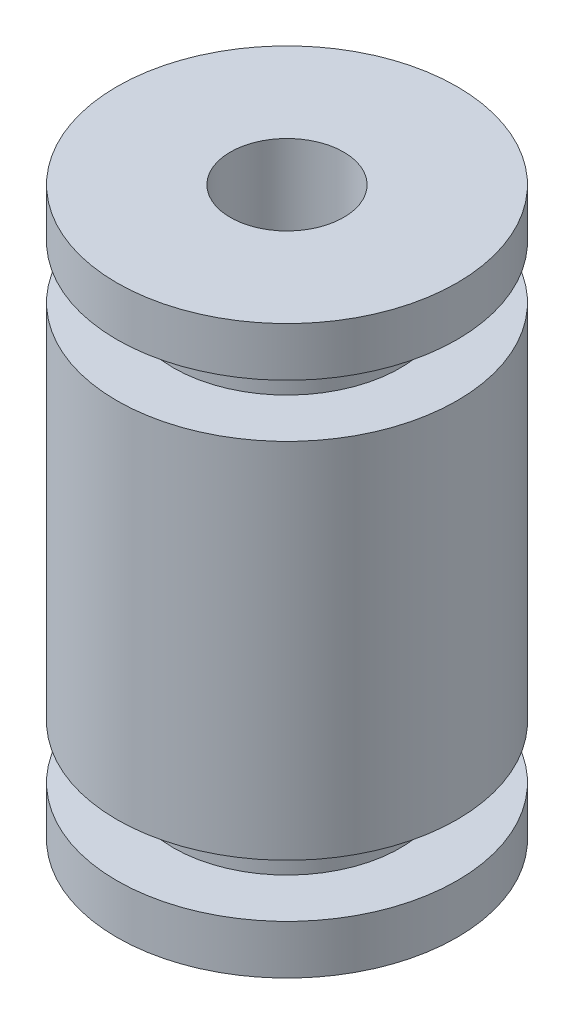
ISO-10303-21;
HEADER;
FILE_DESCRIPTION(('STEP AP214'),'2;1');
FILE_NAME('part.step','',(''),(''),'','','');
FILE_SCHEMA(('AUTOMOTIVE_DESIGN { 1 0 10303 214 1 1 1 1 }'));
ENDSEC;
DATA;
#1=APPLICATION_CONTEXT('core data for automotive mechanical design processes');
#2=APPLICATION_PROTOCOL_DEFINITION('international standard','automotive_design',2000,#1);
#3=PRODUCT_CONTEXT('',#1,'mechanical');
#4=PRODUCT('Part','Part','',(#3));
#5=PRODUCT_RELATED_PRODUCT_CATEGORY('part','',(#4));
#6=PRODUCT_DEFINITION_FORMATION('','',#4);
#7=PRODUCT_DEFINITION_CONTEXT('part definition',#1,'design');
#8=PRODUCT_DEFINITION('design','',#6,#7);
#9=PRODUCT_DEFINITION_SHAPE('','',#8);
#10=(LENGTH_UNIT() NAMED_UNIT(*) SI_UNIT(.MILLI.,.METRE.));
#11=(NAMED_UNIT(*) PLANE_ANGLE_UNIT() SI_UNIT($,.RADIAN.));
#12=(NAMED_UNIT(*) SI_UNIT($,.STERADIAN.) SOLID_ANGLE_UNIT());
#13=UNCERTAINTY_MEASURE_WITH_UNIT(LENGTH_MEASURE(1.E-05),#10,'distance_accuracy_value','');
#14=(GEOMETRIC_REPRESENTATION_CONTEXT(3) GLOBAL_UNCERTAINTY_ASSIGNED_CONTEXT((#13)) GLOBAL_UNIT_ASSIGNED_CONTEXT((#10,
#11,#12)) REPRESENTATION_CONTEXT('',''));
#15=CARTESIAN_POINT('',(0.,0.,0.));
#16=DIRECTION('',(0.,0.,1.));
#17=DIRECTION('',(1.,0.,0.));
#18=AXIS2_PLACEMENT_3D('',#15,#16,#17);
#19=CARTESIAN_POINT('',(-1.5,7.5,0.));
#20=DIRECTION('',(0.,-1.,0.));
#21=DIRECTION('',(0.,0.,-1.));
#22=AXIS2_PLACEMENT_3D('',#19,#20,#21);
#23=PLANE('',#22);
#24=CARTESIAN_POINT('',(0.,7.5,0.));
#25=DIRECTION('',(0.,-1.,0.));
#26=DIRECTION('',(0.,0.,-1.));
#27=AXIS2_PLACEMENT_3D('',#24,#25,#26);
#28=CIRCLE('',#27,4.5);
#29=CARTESIAN_POINT('',(0.,7.5,-4.5));
#30=VERTEX_POINT('',#29);
#31=EDGE_CURVE('E10',#30,#30,#28,.T.);
#32=ORIENTED_EDGE('',*,*,#31,.F.);
#33=EDGE_LOOP('',(#32));
#34=FACE_BOUND('',#33,.T.);
#35=CARTESIAN_POINT('',(0.,7.5,0.));
#36=DIRECTION('',(0.,-1.,0.));
#37=DIRECTION('',(0.,0.,-1.));
#38=AXIS2_PLACEMENT_3D('',#35,#36,#37);
#39=CIRCLE('',#38,1.5);
#40=CARTESIAN_POINT('',(0.,7.5,-1.5));
#41=VERTEX_POINT('',#40);
#42=EDGE_CURVE('E71',#41,#41,#39,.T.);
#43=ORIENTED_EDGE('',*,*,#42,.T.);
#44=EDGE_LOOP('',(#43));
#45=FACE_BOUND('',#44,.T.);
#46=ADVANCED_FACE('F31',(#34,#45),#23,.F.);
#47=CARTESIAN_POINT('',(0.,0.,0.));
#48=DIRECTION('',(0.,-1.,0.));
#49=DIRECTION('',(0.,0.,-1.));
#50=AXIS2_PLACEMENT_3D('',#47,#48,#49);
#51=CYLINDRICAL_SURFACE('',#50,4.5);
#52=CARTESIAN_POINT('',(0.,6.2,0.));
#53=DIRECTION('',(0.,-1.,0.));
#54=DIRECTION('',(0.,0.,-1.));
#55=AXIS2_PLACEMENT_3D('',#52,#53,#54);
#56=CIRCLE('',#55,4.5);
#57=CARTESIAN_POINT('',(0.,6.2,-4.5));
#58=VERTEX_POINT('',#57);
#59=EDGE_CURVE('E37',#58,#58,#56,.T.);
#60=ORIENTED_EDGE('',*,*,#59,.F.);
#61=EDGE_LOOP('',(#60));
#62=FACE_BOUND('',#61,.T.);
#63=ORIENTED_EDGE('',*,*,#31,.T.);
#64=EDGE_LOOP('',(#63));
#65=FACE_BOUND('',#64,.T.);
#66=ADVANCED_FACE('F132',(#62,#65),#51,.T.);
#67=CARTESIAN_POINT('',(-4.5,6.2,0.));
#68=DIRECTION('',(0.,1.,0.));
#69=DIRECTION('',(0.,0.,1.));
#70=AXIS2_PLACEMENT_3D('',#67,#68,#69);
#71=PLANE('',#70);
#72=CARTESIAN_POINT('',(0.,6.2,0.));
#73=DIRECTION('',(0.,-1.,0.));
#74=DIRECTION('',(0.,0.,-1.));
#75=AXIS2_PLACEMENT_3D('',#72,#73,#74);
#76=CIRCLE('',#75,3.);
#77=CARTESIAN_POINT('',(0.,6.2,-3.));
#78=VERTEX_POINT('',#77);
#79=EDGE_CURVE('E41',#78,#78,#76,.T.);
#80=ORIENTED_EDGE('',*,*,#79,.F.);
#81=EDGE_LOOP('',(#80));
#82=FACE_BOUND('',#81,.T.);
#83=ORIENTED_EDGE('',*,*,#59,.T.);
#84=EDGE_LOOP('',(#83));
#85=FACE_BOUND('',#84,.T.);
#86=ADVANCED_FACE('F127',(#82,#85),#71,.F.);
#87=CARTESIAN_POINT('',(0.,0.,0.));
#88=DIRECTION('',(0.,-1.,0.));
#89=DIRECTION('',(0.,0.,-1.));
#90=AXIS2_PLACEMENT_3D('',#87,#88,#89);
#91=CYLINDRICAL_SURFACE('',#90,3.);
#92=CARTESIAN_POINT('',(0.,4.8,0.));
#93=DIRECTION('',(0.,-1.,0.));
#94=DIRECTION('',(0.,0.,-1.));
#95=AXIS2_PLACEMENT_3D('',#92,#93,#94);
#96=CIRCLE('',#95,3.);
#97=CARTESIAN_POINT('',(0.,4.8,-3.));
#98=VERTEX_POINT('',#97);
#99=EDGE_CURVE('E45',#98,#98,#96,.T.);
#100=ORIENTED_EDGE('',*,*,#99,.F.);
#101=EDGE_LOOP('',(#100));
#102=FACE_BOUND('',#101,.T.);
#103=ORIENTED_EDGE('',*,*,#79,.T.);
#104=EDGE_LOOP('',(#103));
#105=FACE_BOUND('',#104,.T.);
#106=ADVANCED_FACE('F121',(#102,#105),#91,.T.);
#107=CARTESIAN_POINT('',(-3.,4.8,0.));
#108=DIRECTION('',(0.,-1.,0.));
#109=DIRECTION('',(0.,0.,-1.));
#110=AXIS2_PLACEMENT_3D('',#107,#108,#109);
#111=PLANE('',#110);
#112=CARTESIAN_POINT('',(0.,4.8,0.));
#113=DIRECTION('',(0.,-1.,0.));
#114=DIRECTION('',(0.,0.,-1.));
#115=AXIS2_PLACEMENT_3D('',#112,#113,#114);
#116=CIRCLE('',#115,4.5);
#117=CARTESIAN_POINT('',(0.,4.8,-4.5));
#118=VERTEX_POINT('',#117);
#119=EDGE_CURVE('E50',#118,#118,#116,.T.);
#120=ORIENTED_EDGE('',*,*,#119,.F.);
#121=EDGE_LOOP('',(#120));
#122=FACE_BOUND('',#121,.T.);
#123=ORIENTED_EDGE('',*,*,#99,.T.);
#124=EDGE_LOOP('',(#123));
#125=FACE_BOUND('',#124,.T.);
#126=ADVANCED_FACE('F115',(#122,#125),#111,.F.);
#127=CARTESIAN_POINT('',(0.,0.,0.));
#128=DIRECTION('',(0.,-1.,0.));
#129=DIRECTION('',(0.,0.,-1.));
#130=AXIS2_PLACEMENT_3D('',#127,#128,#129);
#131=CYLINDRICAL_SURFACE('',#130,4.5);
#132=CARTESIAN_POINT('',(0.,-4.8,0.));
#133=DIRECTION('',(0.,-1.,0.));
#134=DIRECTION('',(0.,0.,-1.));
#135=AXIS2_PLACEMENT_3D('',#132,#133,#134);
#136=CIRCLE('',#135,4.5);
#137=CARTESIAN_POINT('',(0.,-4.8,-4.5));
#138=VERTEX_POINT('',#137);
#139=EDGE_CURVE('E53',#138,#138,#136,.T.);
#140=ORIENTED_EDGE('',*,*,#139,.F.);
#141=EDGE_LOOP('',(#140));
#142=FACE_BOUND('',#141,.T.);
#143=ORIENTED_EDGE('',*,*,#119,.T.);
#144=EDGE_LOOP('',(#143));
#145=FACE_BOUND('',#144,.T.);
#146=ADVANCED_FACE('F109',(#142,#145),#131,.T.);
#147=CARTESIAN_POINT('',(-3.,-4.8,0.));
#148=DIRECTION('',(0.,1.,0.));
#149=DIRECTION('',(0.,0.,1.));
#150=AXIS2_PLACEMENT_3D('',#147,#148,#149);
#151=PLANE('',#150);
#152=CARTESIAN_POINT('',(0.,-4.8,0.));
#153=DIRECTION('',(0.,-1.,0.));
#154=DIRECTION('',(0.,0.,-1.));
#155=AXIS2_PLACEMENT_3D('',#152,#153,#154);
#156=CIRCLE('',#155,3.);
#157=CARTESIAN_POINT('',(0.,-4.8,-3.));
#158=VERTEX_POINT('',#157);
#159=EDGE_CURVE('E56',#158,#158,#156,.T.);
#160=ORIENTED_EDGE('',*,*,#159,.F.);
#161=EDGE_LOOP('',(#160));
#162=FACE_BOUND('',#161,.T.);
#163=ORIENTED_EDGE('',*,*,#139,.T.);
#164=EDGE_LOOP('',(#163));
#165=FACE_BOUND('',#164,.T.);
#166=ADVANCED_FACE('F103',(#162,#165),#151,.F.);
#167=CARTESIAN_POINT('',(0.,0.,0.));
#168=DIRECTION('',(0.,-1.,0.));
#169=DIRECTION('',(0.,0.,-1.));
#170=AXIS2_PLACEMENT_3D('',#167,#168,#169);
#171=CYLINDRICAL_SURFACE('',#170,3.);
#172=CARTESIAN_POINT('',(0.,-6.2,0.));
#173=DIRECTION('',(0.,-1.,0.));
#174=DIRECTION('',(0.,0.,-1.));
#175=AXIS2_PLACEMENT_3D('',#172,#173,#174);
#176=CIRCLE('',#175,3.);
#177=CARTESIAN_POINT('',(0.,-6.2,-3.));
#178=VERTEX_POINT('',#177);
#179=EDGE_CURVE('E59',#178,#178,#176,.T.);
#180=ORIENTED_EDGE('',*,*,#179,.F.);
#181=EDGE_LOOP('',(#180));
#182=FACE_BOUND('',#181,.T.);
#183=ORIENTED_EDGE('',*,*,#159,.T.);
#184=EDGE_LOOP('',(#183));
#185=FACE_BOUND('',#184,.T.);
#186=ADVANCED_FACE('F97',(#182,#185),#171,.T.);
#187=CARTESIAN_POINT('',(-4.5,-6.2,0.));
#188=DIRECTION('',(0.,-1.,0.));
#189=DIRECTION('',(0.,0.,-1.));
#190=AXIS2_PLACEMENT_3D('',#187,#188,#189);
#191=PLANE('',#190);
#192=CARTESIAN_POINT('',(0.,-6.2,0.));
#193=DIRECTION('',(0.,-1.,0.));
#194=DIRECTION('',(0.,0.,-1.));
#195=AXIS2_PLACEMENT_3D('',#192,#193,#194);
#196=CIRCLE('',#195,4.5);
#197=CARTESIAN_POINT('',(0.,-6.2,-4.5));
#198=VERTEX_POINT('',#197);
#199=EDGE_CURVE('E62',#198,#198,#196,.T.);
#200=ORIENTED_EDGE('',*,*,#199,.F.);
#201=EDGE_LOOP('',(#200));
#202=FACE_BOUND('',#201,.T.);
#203=ORIENTED_EDGE('',*,*,#179,.T.);
#204=EDGE_LOOP('',(#203));
#205=FACE_BOUND('',#204,.T.);
#206=ADVANCED_FACE('F91',(#202,#205),#191,.F.);
#207=CARTESIAN_POINT('',(0.,0.,0.));
#208=DIRECTION('',(0.,-1.,0.));
#209=DIRECTION('',(0.,0.,-1.));
#210=AXIS2_PLACEMENT_3D('',#207,#208,#209);
#211=CYLINDRICAL_SURFACE('',#210,4.5);
#212=CARTESIAN_POINT('',(0.,-7.5,0.));
#213=DIRECTION('',(0.,-1.,0.));
#214=DIRECTION('',(0.,0.,-1.));
#215=AXIS2_PLACEMENT_3D('',#212,#213,#214);
#216=CIRCLE('',#215,4.5);
#217=CARTESIAN_POINT('',(0.,-7.5,-4.5));
#218=VERTEX_POINT('',#217);
#219=EDGE_CURVE('E65',#218,#218,#216,.T.);
#220=ORIENTED_EDGE('',*,*,#219,.F.);
#221=EDGE_LOOP('',(#220));
#222=FACE_BOUND('',#221,.T.);
#223=ORIENTED_EDGE('',*,*,#199,.T.);
#224=EDGE_LOOP('',(#223));
#225=FACE_BOUND('',#224,.T.);
#226=ADVANCED_FACE('F85',(#222,#225),#211,.T.);
#227=CARTESIAN_POINT('',(-1.5,-7.5,0.));
#228=DIRECTION('',(0.,1.,0.));
#229=DIRECTION('',(0.,0.,1.));
#230=AXIS2_PLACEMENT_3D('',#227,#228,#229);
#231=PLANE('',#230);
#232=CARTESIAN_POINT('',(0.,-7.5,0.));
#233=DIRECTION('',(0.,-1.,0.));
#234=DIRECTION('',(0.,0.,-1.));
#235=AXIS2_PLACEMENT_3D('',#232,#233,#234);
#236=CIRCLE('',#235,1.5);
#237=CARTESIAN_POINT('',(0.,-7.5,-1.5));
#238=VERTEX_POINT('',#237);
#239=EDGE_CURVE('E68',#238,#238,#236,.T.);
#240=ORIENTED_EDGE('',*,*,#239,.F.);
#241=EDGE_LOOP('',(#240));
#242=FACE_BOUND('',#241,.T.);
#243=ORIENTED_EDGE('',*,*,#219,.T.);
#244=EDGE_LOOP('',(#243));
#245=FACE_BOUND('',#244,.T.);
#246=ADVANCED_FACE('F79',(#242,#245),#231,.F.);
#247=CARTESIAN_POINT('',(0.,0.,0.));
#248=DIRECTION('',(0.,-1.,0.));
#249=DIRECTION('',(0.,0.,-1.));
#250=AXIS2_PLACEMENT_3D('',#247,#248,#249);
#251=CYLINDRICAL_SURFACE('',#250,1.5);
#252=ORIENTED_EDGE('',*,*,#42,.F.);
#253=EDGE_LOOP('',(#252));
#254=FACE_BOUND('',#253,.T.);
#255=ORIENTED_EDGE('',*,*,#239,.T.);
#256=EDGE_LOOP('',(#255));
#257=FACE_BOUND('',#256,.T.);
#258=ADVANCED_FACE('F76',(#254,#257),#251,.F.);
#259=CLOSED_SHELL('',(#46,#66,#86,#106,#126,#146,#166,#186,#206,#226,#246,#258));
#260=MANIFOLD_SOLID_BREP('B2',#259);
#261=ADVANCED_BREP_SHAPE_REPRESENTATION('',(#18,#260),#14);
#262=SHAPE_DEFINITION_REPRESENTATION(#9,#261);
ENDSEC;
END-ISO-10303-21;
